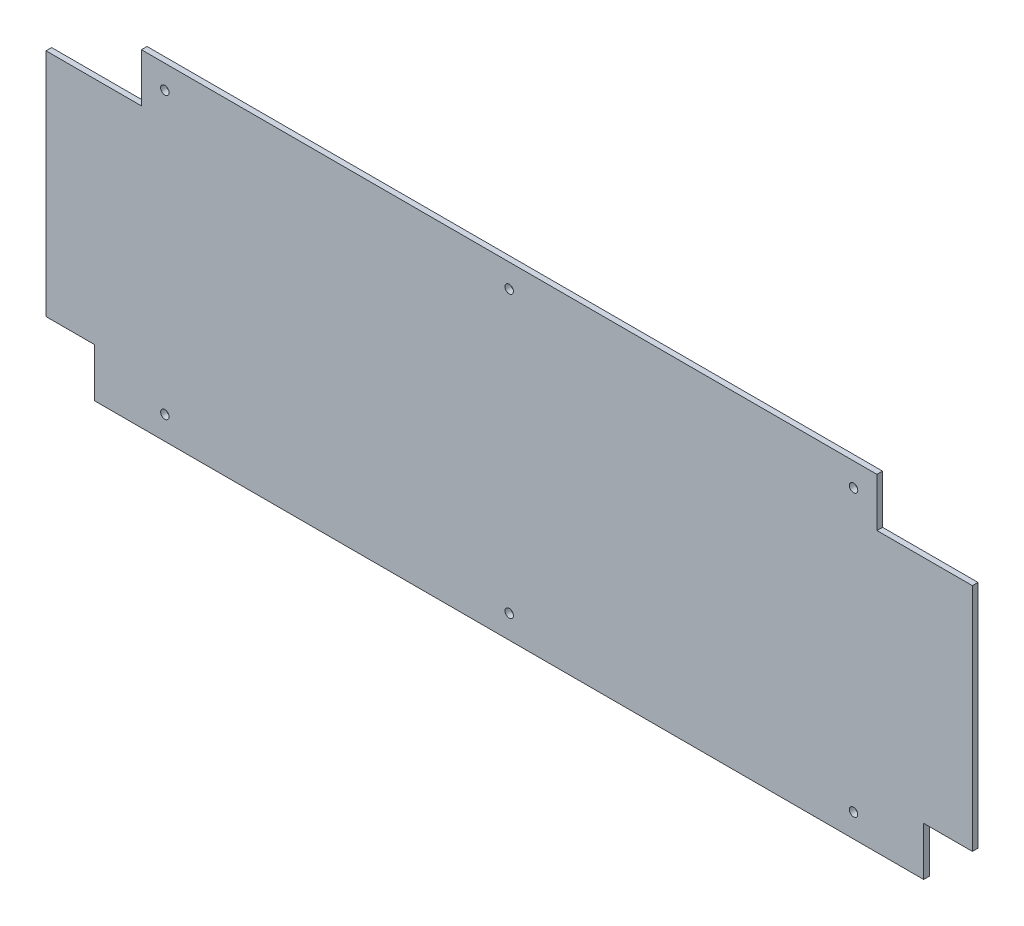
ISO-10303-21;
HEADER;
FILE_DESCRIPTION(('STEP AP214'),'2;1');
FILE_NAME('part.step','',(''),(''),'','','');
FILE_SCHEMA(('AUTOMOTIVE_DESIGN { 1 0 10303 214 1 1 1 1 }'));
ENDSEC;
DATA;
#1=APPLICATION_CONTEXT('core data for automotive mechanical design processes');
#2=APPLICATION_PROTOCOL_DEFINITION('international standard','automotive_design',2000,#1);
#3=PRODUCT_CONTEXT('',#1,'mechanical');
#4=PRODUCT('Part','Part','',(#3));
#5=PRODUCT_RELATED_PRODUCT_CATEGORY('part','',(#4));
#6=PRODUCT_DEFINITION_FORMATION('','',#4);
#7=PRODUCT_DEFINITION_CONTEXT('part definition',#1,'design');
#8=PRODUCT_DEFINITION('design','',#6,#7);
#9=PRODUCT_DEFINITION_SHAPE('','',#8);
#10=(LENGTH_UNIT() NAMED_UNIT(*) SI_UNIT(.MILLI.,.METRE.));
#11=(NAMED_UNIT(*) PLANE_ANGLE_UNIT() SI_UNIT($,.RADIAN.));
#12=(NAMED_UNIT(*) SI_UNIT($,.STERADIAN.) SOLID_ANGLE_UNIT());
#13=UNCERTAINTY_MEASURE_WITH_UNIT(LENGTH_MEASURE(1.E-05),#10,'distance_accuracy_value','');
#14=(GEOMETRIC_REPRESENTATION_CONTEXT(3) GLOBAL_UNCERTAINTY_ASSIGNED_CONTEXT((#13)) GLOBAL_UNIT_ASSIGNED_CONTEXT((#10,
#11,#12)) REPRESENTATION_CONTEXT('',''));
#15=CARTESIAN_POINT('',(0.,0.,0.));
#16=DIRECTION('',(0.,0.,1.));
#17=DIRECTION('',(1.,0.,0.));
#18=AXIS2_PLACEMENT_3D('',#15,#16,#17);
#19=CARTESIAN_POINT('',(0.,0.,0.));
#20=DIRECTION('',(0.,0.,-1.));
#21=DIRECTION('',(-1.,0.,0.));
#22=AXIS2_PLACEMENT_3D('',#19,#20,#21);
#23=PLANE('',#22);
#24=CARTESIAN_POINT('',(253.145266950842,12.5,0.));
#25=DIRECTION('',(0.,0.,1.));
#26=DIRECTION('',(1.,0.,0.));
#27=AXIS2_PLACEMENT_3D('',#24,#25,#26);
#28=CIRCLE('',#27,2.24999999999997);
#29=CARTESIAN_POINT('',(255.395266950842,12.5,0.));
#30=VERTEX_POINT('',#29);
#31=EDGE_CURVE('E290',#30,#30,#28,.T.);
#32=ORIENTED_EDGE('',*,*,#31,.T.);
#33=EDGE_LOOP('',(#32));
#34=FACE_BOUND('',#33,.T.);
#35=DIRECTION('',(0.,1.,0.));
#36=VECTOR('',#35,1.);
#37=CARTESIAN_POINT('',(449.64526695086,175.,0.));
#38=LINE('',#37,#36);
#39=CARTESIAN_POINT('',(449.64526695086,149.000000000001,0.));
#40=VERTEX_POINT('',#39);
#41=CARTESIAN_POINT('',(449.64526695086,175.,0.));
#42=VERTEX_POINT('',#41);
#43=EDGE_CURVE('E154',#40,#42,#38,.T.);
#44=ORIENTED_EDGE('',*,*,#43,.F.);
#45=DIRECTION('',(-1.,0.,0.));
#46=VECTOR('',#45,1.);
#47=CARTESIAN_POINT('',(500.64526695086,149.000000000001,0.));
#48=LINE('',#47,#46);
#49=CARTESIAN_POINT('',(500.64526695086,149.000000000001,0.));
#50=VERTEX_POINT('',#49);
#51=EDGE_CURVE('E97',#50,#40,#48,.T.);
#52=ORIENTED_EDGE('',*,*,#51,.F.);
#53=DIRECTION('',(0.,1.,0.));
#54=VECTOR('',#53,1.);
#55=CARTESIAN_POINT('',(500.64526695086,26.,0.));
#56=LINE('',#55,#54);
#57=CARTESIAN_POINT('',(500.64526695086,26.,0.));
#58=VERTEX_POINT('',#57);
#59=EDGE_CURVE('E91',#58,#50,#56,.T.);
#60=ORIENTED_EDGE('',*,*,#59,.F.);
#61=DIRECTION('',(1.,0.,0.));
#62=VECTOR('',#61,1.);
#63=CARTESIAN_POINT('',(500.64526695086,26.,0.));
#64=LINE('',#63,#62);
#65=CARTESIAN_POINT('',(474.64526695086,26.,0.));
#66=VERTEX_POINT('',#65);
#67=EDGE_CURVE('E144',#66,#58,#64,.T.);
#68=ORIENTED_EDGE('',*,*,#67,.F.);
#69=DIRECTION('',(0.,1.,0.));
#70=VECTOR('',#69,1.);
#71=CARTESIAN_POINT('',(474.64526695086,0.,0.));
#72=LINE('',#71,#70);
#73=CARTESIAN_POINT('',(474.64526695086,0.,0.));
#74=VERTEX_POINT('',#73);
#75=EDGE_CURVE('E172',#74,#66,#72,.T.);
#76=ORIENTED_EDGE('',*,*,#75,.F.);
#77=DIRECTION('',(1.,0.,0.));
#78=VECTOR('',#77,1.);
#79=CARTESIAN_POINT('',(31.6452669508233,0.,0.));
#80=LINE('',#79,#78);
#81=CARTESIAN_POINT('',(31.6452669508233,0.,0.));
#82=VERTEX_POINT('',#81);
#83=EDGE_CURVE('E170',#82,#74,#80,.T.);
#84=ORIENTED_EDGE('',*,*,#83,.F.);
#85=DIRECTION('',(0.,-1.,0.));
#86=VECTOR('',#85,1.);
#87=CARTESIAN_POINT('',(31.6452669508233,0.,0.));
#88=LINE('',#87,#86);
#89=CARTESIAN_POINT('',(31.6452669508233,26.,0.));
#90=VERTEX_POINT('',#89);
#91=EDGE_CURVE('E168',#90,#82,#88,.T.);
#92=ORIENTED_EDGE('',*,*,#91,.F.);
#93=DIRECTION('',(1.,0.,0.));
#94=VECTOR('',#93,1.);
#95=CARTESIAN_POINT('',(5.64526695082328,26.,0.));
#96=LINE('',#95,#94);
#97=CARTESIAN_POINT('',(5.64526695082328,26.,0.));
#98=VERTEX_POINT('',#97);
#99=EDGE_CURVE('E166',#98,#90,#96,.T.);
#100=ORIENTED_EDGE('',*,*,#99,.F.);
#101=DIRECTION('',(0.,-1.,0.));
#102=VECTOR('',#101,1.);
#103=CARTESIAN_POINT('',(5.64526695082328,26.,0.));
#104=LINE('',#103,#102);
#105=CARTESIAN_POINT('',(5.64526695082328,149.,0.));
#106=VERTEX_POINT('',#105);
#107=EDGE_CURVE('E164',#106,#98,#104,.T.);
#108=ORIENTED_EDGE('',*,*,#107,.F.);
#109=DIRECTION('',(-1.,0.,0.));
#110=VECTOR('',#109,1.);
#111=CARTESIAN_POINT('',(5.64526695082328,149.,0.));
#112=LINE('',#111,#110);
#113=CARTESIAN_POINT('',(56.6452669508233,149.,0.));
#114=VERTEX_POINT('',#113);
#115=EDGE_CURVE('E162',#114,#106,#112,.T.);
#116=ORIENTED_EDGE('',*,*,#115,.F.);
#117=DIRECTION('',(0.,-1.,0.));
#118=VECTOR('',#117,1.);
#119=CARTESIAN_POINT('',(56.6452669508233,175.,0.));
#120=LINE('',#119,#118);
#121=CARTESIAN_POINT('',(56.6452669508233,175.,0.));
#122=VERTEX_POINT('',#121);
#123=EDGE_CURVE('E160',#122,#114,#120,.T.);
#124=ORIENTED_EDGE('',*,*,#123,.F.);
#125=DIRECTION('',(-1.,0.,0.));
#126=VECTOR('',#125,1.);
#127=CARTESIAN_POINT('',(56.6452669508233,175.,0.));
#128=LINE('',#127,#126);
#129=EDGE_CURVE('E157',#42,#122,#128,.T.);
#130=ORIENTED_EDGE('',*,*,#129,.F.);
#131=EDGE_LOOP('',(#44,#52,#60,#68,#76,#84,#92,#100,#108,#116,#124,#130));
#132=FACE_BOUND('',#131,.T.);
#133=CARTESIAN_POINT('',(69.1452669508233,12.5,0.));
#134=DIRECTION('',(0.,0.,1.));
#135=DIRECTION('',(1.,0.,0.));
#136=AXIS2_PLACEMENT_3D('',#133,#134,#135);
#137=CIRCLE('',#136,2.25);
#138=CARTESIAN_POINT('',(71.3952669508233,12.5,0.));
#139=VERTEX_POINT('',#138);
#140=EDGE_CURVE('E158',#139,#139,#137,.T.);
#141=ORIENTED_EDGE('',*,*,#140,.T.);
#142=EDGE_LOOP('',(#141));
#143=FACE_BOUND('',#142,.T.);
#144=CARTESIAN_POINT('',(69.1452669508233,162.5,0.));
#145=DIRECTION('',(0.,0.,1.));
#146=DIRECTION('',(1.,0.,0.));
#147=AXIS2_PLACEMENT_3D('',#144,#145,#146);
#148=CIRCLE('',#147,2.25);
#149=CARTESIAN_POINT('',(71.3952669508233,162.5,0.));
#150=VERTEX_POINT('',#149);
#151=EDGE_CURVE('E318',#150,#150,#148,.T.);
#152=ORIENTED_EDGE('',*,*,#151,.T.);
#153=EDGE_LOOP('',(#152));
#154=FACE_BOUND('',#153,.T.);
#155=CARTESIAN_POINT('',(437.14526695086,162.5,0.));
#156=DIRECTION('',(0.,0.,1.));
#157=DIRECTION('',(1.,0.,0.));
#158=AXIS2_PLACEMENT_3D('',#155,#156,#157);
#159=CIRCLE('',#158,2.24999999999997);
#160=CARTESIAN_POINT('',(439.39526695086,162.5,0.));
#161=VERTEX_POINT('',#160);
#162=EDGE_CURVE('E312',#161,#161,#159,.T.);
#163=ORIENTED_EDGE('',*,*,#162,.T.);
#164=EDGE_LOOP('',(#163));
#165=FACE_BOUND('',#164,.T.);
#166=CARTESIAN_POINT('',(437.14526695086,12.5,0.));
#167=DIRECTION('',(0.,0.,1.));
#168=DIRECTION('',(1.,0.,0.));
#169=AXIS2_PLACEMENT_3D('',#166,#167,#168);
#170=CIRCLE('',#169,2.24999999999997);
#171=CARTESIAN_POINT('',(439.39526695086,12.5,0.));
#172=VERTEX_POINT('',#171);
#173=EDGE_CURVE('E306',#172,#172,#170,.T.);
#174=ORIENTED_EDGE('',*,*,#173,.T.);
#175=EDGE_LOOP('',(#174));
#176=FACE_BOUND('',#175,.T.);
#177=CARTESIAN_POINT('',(253.145266950842,162.5,0.));
#178=DIRECTION('',(0.,0.,1.));
#179=DIRECTION('',(1.,0.,0.));
#180=AXIS2_PLACEMENT_3D('',#177,#178,#179);
#181=CIRCLE('',#180,2.24999999999997);
#182=CARTESIAN_POINT('',(255.395266950842,162.5,0.));
#183=VERTEX_POINT('',#182);
#184=EDGE_CURVE('E300',#183,#183,#181,.T.);
#185=ORIENTED_EDGE('',*,*,#184,.T.);
#186=EDGE_LOOP('',(#185));
#187=FACE_BOUND('',#186,.T.);
#188=ADVANCED_FACE('F33',(#34,#132,#143,#154,#165,#176,#187),#23,.T.);
#189=CARTESIAN_POINT('',(449.64526695086,175.,3.));
#190=DIRECTION('',(-1.,0.,0.));
#191=DIRECTION('',(0.,0.,1.));
#192=AXIS2_PLACEMENT_3D('',#189,#190,#191);
#193=PLANE('',#192);
#194=ORIENTED_EDGE('',*,*,#43,.T.);
#195=DIRECTION('',(0.,0.,-1.));
#196=VECTOR('',#195,1.);
#197=CARTESIAN_POINT('',(449.64526695086,175.,3.));
#198=LINE('',#197,#196);
#199=CARTESIAN_POINT('',(449.64526695086,175.,3.));
#200=VERTEX_POINT('',#199);
#201=EDGE_CURVE('E11',#200,#42,#198,.T.);
#202=ORIENTED_EDGE('',*,*,#201,.F.);
#203=DIRECTION('',(0.,1.,0.));
#204=VECTOR('',#203,1.);
#205=CARTESIAN_POINT('',(449.64526695086,175.,3.));
#206=LINE('',#205,#204);
#207=CARTESIAN_POINT('',(449.64526695086,149.000000000001,3.));
#208=VERTEX_POINT('',#207);
#209=EDGE_CURVE('E177',#208,#200,#206,.T.);
#210=ORIENTED_EDGE('',*,*,#209,.F.);
#211=DIRECTION('',(0.,0.,-1.));
#212=VECTOR('',#211,1.);
#213=CARTESIAN_POINT('',(449.64526695086,149.000000000001,3.));
#214=LINE('',#213,#212);
#215=EDGE_CURVE('E150',#208,#40,#214,.T.);
#216=ORIENTED_EDGE('',*,*,#215,.T.);
#217=EDGE_LOOP('',(#194,#202,#210,#216));
#218=FACE_BOUND('',#217,.T.);
#219=ADVANCED_FACE('F35',(#218),#193,.F.);
#220=CARTESIAN_POINT('',(56.6452669508233,175.,3.));
#221=DIRECTION('',(0.,-1.,0.));
#222=DIRECTION('',(0.,0.,-1.));
#223=AXIS2_PLACEMENT_3D('',#220,#221,#222);
#224=PLANE('',#223);
#225=ORIENTED_EDGE('',*,*,#129,.T.);
#226=DIRECTION('',(0.,0.,-1.));
#227=VECTOR('',#226,1.);
#228=CARTESIAN_POINT('',(56.6452669508233,175.,3.));
#229=LINE('',#228,#227);
#230=CARTESIAN_POINT('',(56.6452669508233,175.,3.));
#231=VERTEX_POINT('',#230);
#232=EDGE_CURVE('E42',#231,#122,#229,.T.);
#233=ORIENTED_EDGE('',*,*,#232,.F.);
#234=DIRECTION('',(-1.,0.,0.));
#235=VECTOR('',#234,1.);
#236=CARTESIAN_POINT('',(56.6452669508233,175.,3.));
#237=LINE('',#236,#235);
#238=EDGE_CURVE('E105',#200,#231,#237,.T.);
#239=ORIENTED_EDGE('',*,*,#238,.F.);
#240=ORIENTED_EDGE('',*,*,#201,.T.);
#241=EDGE_LOOP('',(#225,#233,#239,#240));
#242=FACE_BOUND('',#241,.T.);
#243=ADVANCED_FACE('F261',(#242),#224,.F.);
#244=CARTESIAN_POINT('',(56.6452669508233,175.,3.));
#245=DIRECTION('',(1.,0.,0.));
#246=DIRECTION('',(0.,0.,-1.));
#247=AXIS2_PLACEMENT_3D('',#244,#245,#246);
#248=PLANE('',#247);
#249=ORIENTED_EDGE('',*,*,#123,.T.);
#250=DIRECTION('',(0.,0.,-1.));
#251=VECTOR('',#250,1.);
#252=CARTESIAN_POINT('',(56.6452669508233,149.,3.));
#253=LINE('',#252,#251);
#254=CARTESIAN_POINT('',(56.6452669508233,149.,3.));
#255=VERTEX_POINT('',#254);
#256=EDGE_CURVE('E196',#255,#114,#253,.T.);
#257=ORIENTED_EDGE('',*,*,#256,.F.);
#258=DIRECTION('',(0.,-1.,0.));
#259=VECTOR('',#258,1.);
#260=CARTESIAN_POINT('',(56.6452669508233,175.,3.));
#261=LINE('',#260,#259);
#262=EDGE_CURVE('E204',#231,#255,#261,.T.);
#263=ORIENTED_EDGE('',*,*,#262,.F.);
#264=ORIENTED_EDGE('',*,*,#232,.T.);
#265=EDGE_LOOP('',(#249,#257,#263,#264));
#266=FACE_BOUND('',#265,.T.);
#267=ADVANCED_FACE('F202',(#266),#248,.F.);
#268=CARTESIAN_POINT('',(5.64526695082328,149.,3.));
#269=DIRECTION('',(0.,-1.,0.));
#270=DIRECTION('',(0.,0.,-1.));
#271=AXIS2_PLACEMENT_3D('',#268,#269,#270);
#272=PLANE('',#271);
#273=ORIENTED_EDGE('',*,*,#115,.T.);
#274=DIRECTION('',(0.,0.,-1.));
#275=VECTOR('',#274,1.);
#276=CARTESIAN_POINT('',(5.64526695082328,149.,3.));
#277=LINE('',#276,#275);
#278=CARTESIAN_POINT('',(5.64526695082328,149.,3.));
#279=VERTEX_POINT('',#278);
#280=EDGE_CURVE('E193',#279,#106,#277,.T.);
#281=ORIENTED_EDGE('',*,*,#280,.F.);
#282=DIRECTION('',(-1.,0.,0.));
#283=VECTOR('',#282,1.);
#284=CARTESIAN_POINT('',(5.64526695082328,149.,3.));
#285=LINE('',#284,#283);
#286=EDGE_CURVE('E222',#255,#279,#285,.T.);
#287=ORIENTED_EDGE('',*,*,#286,.F.);
#288=ORIENTED_EDGE('',*,*,#256,.T.);
#289=EDGE_LOOP('',(#273,#281,#287,#288));
#290=FACE_BOUND('',#289,.T.);
#291=ADVANCED_FACE('F213',(#290),#272,.F.);
#292=CARTESIAN_POINT('',(5.64526695082328,26.,3.));
#293=DIRECTION('',(1.,0.,0.));
#294=DIRECTION('',(0.,0.,-1.));
#295=AXIS2_PLACEMENT_3D('',#292,#293,#294);
#296=PLANE('',#295);
#297=ORIENTED_EDGE('',*,*,#107,.T.);
#298=DIRECTION('',(0.,0.,-1.));
#299=VECTOR('',#298,1.);
#300=CARTESIAN_POINT('',(5.64526695082328,26.,3.));
#301=LINE('',#300,#299);
#302=CARTESIAN_POINT('',(5.64526695082328,26.,3.));
#303=VERTEX_POINT('',#302);
#304=EDGE_CURVE('E190',#303,#98,#301,.T.);
#305=ORIENTED_EDGE('',*,*,#304,.F.);
#306=DIRECTION('',(0.,-1.,0.));
#307=VECTOR('',#306,1.);
#308=CARTESIAN_POINT('',(5.64526695082328,26.,3.));
#309=LINE('',#308,#307);
#310=EDGE_CURVE('E219',#279,#303,#309,.T.);
#311=ORIENTED_EDGE('',*,*,#310,.F.);
#312=ORIENTED_EDGE('',*,*,#280,.T.);
#313=EDGE_LOOP('',(#297,#305,#311,#312));
#314=FACE_BOUND('',#313,.T.);
#315=ADVANCED_FACE('F217',(#314),#296,.F.);
#316=CARTESIAN_POINT('',(5.64526695082328,26.,3.));
#317=DIRECTION('',(0.,1.,0.));
#318=DIRECTION('',(0.,0.,1.));
#319=AXIS2_PLACEMENT_3D('',#316,#317,#318);
#320=PLANE('',#319);
#321=ORIENTED_EDGE('',*,*,#99,.T.);
#322=DIRECTION('',(0.,0.,-1.));
#323=VECTOR('',#322,1.);
#324=CARTESIAN_POINT('',(31.6452669508233,26.,3.));
#325=LINE('',#324,#323);
#326=CARTESIAN_POINT('',(31.6452669508233,26.,3.));
#327=VERTEX_POINT('',#326);
#328=EDGE_CURVE('E187',#327,#90,#325,.T.);
#329=ORIENTED_EDGE('',*,*,#328,.F.);
#330=DIRECTION('',(1.,0.,0.));
#331=VECTOR('',#330,1.);
#332=CARTESIAN_POINT('',(5.64526695082328,26.,3.));
#333=LINE('',#332,#331);
#334=EDGE_CURVE('E221',#303,#327,#333,.T.);
#335=ORIENTED_EDGE('',*,*,#334,.F.);
#336=ORIENTED_EDGE('',*,*,#304,.T.);
#337=EDGE_LOOP('',(#321,#329,#335,#336));
#338=FACE_BOUND('',#337,.T.);
#339=ADVANCED_FACE('F423',(#338),#320,.F.);
#340=CARTESIAN_POINT('',(31.6452669508233,0.,3.));
#341=DIRECTION('',(1.,0.,0.));
#342=DIRECTION('',(0.,0.,-1.));
#343=AXIS2_PLACEMENT_3D('',#340,#341,#342);
#344=PLANE('',#343);
#345=ORIENTED_EDGE('',*,*,#91,.T.);
#346=DIRECTION('',(0.,0.,-1.));
#347=VECTOR('',#346,1.);
#348=CARTESIAN_POINT('',(31.6452669508233,0.,3.));
#349=LINE('',#348,#347);
#350=CARTESIAN_POINT('',(31.6452669508233,0.,3.));
#351=VERTEX_POINT('',#350);
#352=EDGE_CURVE('E184',#351,#82,#349,.T.);
#353=ORIENTED_EDGE('',*,*,#352,.F.);
#354=DIRECTION('',(0.,-1.,0.));
#355=VECTOR('',#354,1.);
#356=CARTESIAN_POINT('',(31.6452669508233,0.,3.));
#357=LINE('',#356,#355);
#358=EDGE_CURVE('E224',#327,#351,#357,.T.);
#359=ORIENTED_EDGE('',*,*,#358,.F.);
#360=ORIENTED_EDGE('',*,*,#328,.T.);
#361=EDGE_LOOP('',(#345,#353,#359,#360));
#362=FACE_BOUND('',#361,.T.);
#363=ADVANCED_FACE('F414',(#362),#344,.F.);
#364=CARTESIAN_POINT('',(31.6452669508233,0.,3.));
#365=DIRECTION('',(0.,1.,0.));
#366=DIRECTION('',(-1.,0.,0.));
#367=AXIS2_PLACEMENT_3D('',#364,#365,#366);
#368=PLANE('',#367);
#369=ORIENTED_EDGE('',*,*,#83,.T.);
#370=DIRECTION('',(0.,0.,-1.));
#371=VECTOR('',#370,1.);
#372=CARTESIAN_POINT('',(474.64526695086,0.,3.));
#373=LINE('',#372,#371);
#374=CARTESIAN_POINT('',(474.64526695086,0.,3.));
#375=VERTEX_POINT('',#374);
#376=EDGE_CURVE('E181',#375,#74,#373,.T.);
#377=ORIENTED_EDGE('',*,*,#376,.F.);
#378=DIRECTION('',(1.,0.,0.));
#379=VECTOR('',#378,1.);
#380=CARTESIAN_POINT('',(31.6452669508233,0.,3.));
#381=LINE('',#380,#379);
#382=EDGE_CURVE('E230',#351,#375,#381,.T.);
#383=ORIENTED_EDGE('',*,*,#382,.F.);
#384=ORIENTED_EDGE('',*,*,#352,.T.);
#385=EDGE_LOOP('',(#369,#377,#383,#384));
#386=FACE_BOUND('',#385,.T.);
#387=ADVANCED_FACE('F236',(#386),#368,.F.);
#388=CARTESIAN_POINT('',(474.64526695086,0.,3.));
#389=DIRECTION('',(-1.,0.,0.));
#390=DIRECTION('',(0.,0.,1.));
#391=AXIS2_PLACEMENT_3D('',#388,#389,#390);
#392=PLANE('',#391);
#393=ORIENTED_EDGE('',*,*,#75,.T.);
#394=DIRECTION('',(0.,0.,-1.));
#395=VECTOR('',#394,1.);
#396=CARTESIAN_POINT('',(474.64526695086,26.,3.));
#397=LINE('',#396,#395);
#398=CARTESIAN_POINT('',(474.64526695086,26.,3.));
#399=VERTEX_POINT('',#398);
#400=EDGE_CURVE('E145',#399,#66,#397,.T.);
#401=ORIENTED_EDGE('',*,*,#400,.F.);
#402=DIRECTION('',(0.,1.,0.));
#403=VECTOR('',#402,1.);
#404=CARTESIAN_POINT('',(474.64526695086,0.,3.));
#405=LINE('',#404,#403);
#406=EDGE_CURVE('E136',#375,#399,#405,.T.);
#407=ORIENTED_EDGE('',*,*,#406,.F.);
#408=ORIENTED_EDGE('',*,*,#376,.T.);
#409=EDGE_LOOP('',(#393,#401,#407,#408));
#410=FACE_BOUND('',#409,.T.);
#411=ADVANCED_FACE('F240',(#410),#392,.F.);
#412=CARTESIAN_POINT('',(500.64526695086,26.,3.));
#413=DIRECTION('',(0.,1.,0.));
#414=DIRECTION('',(-1.,0.,0.));
#415=AXIS2_PLACEMENT_3D('',#412,#413,#414);
#416=PLANE('',#415);
#417=ORIENTED_EDGE('',*,*,#67,.T.);
#418=DIRECTION('',(0.,0.,-1.));
#419=VECTOR('',#418,1.);
#420=CARTESIAN_POINT('',(500.64526695086,26.,3.));
#421=LINE('',#420,#419);
#422=CARTESIAN_POINT('',(500.64526695086,26.,3.));
#423=VERTEX_POINT('',#422);
#424=EDGE_CURVE('E141',#423,#58,#421,.T.);
#425=ORIENTED_EDGE('',*,*,#424,.F.);
#426=DIRECTION('',(1.,0.,0.));
#427=VECTOR('',#426,1.);
#428=CARTESIAN_POINT('',(500.64526695086,26.,3.));
#429=LINE('',#428,#427);
#430=EDGE_CURVE('E130',#399,#423,#429,.T.);
#431=ORIENTED_EDGE('',*,*,#430,.F.);
#432=ORIENTED_EDGE('',*,*,#400,.T.);
#433=EDGE_LOOP('',(#417,#425,#431,#432));
#434=FACE_BOUND('',#433,.T.);
#435=ADVANCED_FACE('F142',(#434),#416,.F.);
#436=CARTESIAN_POINT('',(500.64526695086,26.,3.));
#437=DIRECTION('',(-1.,0.,0.));
#438=DIRECTION('',(0.,0.,1.));
#439=AXIS2_PLACEMENT_3D('',#436,#437,#438);
#440=PLANE('',#439);
#441=ORIENTED_EDGE('',*,*,#59,.T.);
#442=DIRECTION('',(0.,0.,-1.));
#443=VECTOR('',#442,1.);
#444=CARTESIAN_POINT('',(500.64526695086,149.000000000001,3.));
#445=LINE('',#444,#443);
#446=CARTESIAN_POINT('',(500.64526695086,149.000000000001,3.));
#447=VERTEX_POINT('',#446);
#448=EDGE_CURVE('E146',#447,#50,#445,.T.);
#449=ORIENTED_EDGE('',*,*,#448,.F.);
#450=DIRECTION('',(0.,1.,0.));
#451=VECTOR('',#450,1.);
#452=CARTESIAN_POINT('',(500.64526695086,26.,3.));
#453=LINE('',#452,#451);
#454=EDGE_CURVE('E134',#423,#447,#453,.T.);
#455=ORIENTED_EDGE('',*,*,#454,.F.);
#456=ORIENTED_EDGE('',*,*,#424,.T.);
#457=EDGE_LOOP('',(#441,#449,#455,#456));
#458=FACE_BOUND('',#457,.T.);
#459=ADVANCED_FACE('F148',(#458),#440,.F.);
#460=CARTESIAN_POINT('',(500.64526695086,149.000000000001,3.));
#461=DIRECTION('',(0.,-1.,0.));
#462=DIRECTION('',(1.,0.,0.));
#463=AXIS2_PLACEMENT_3D('',#460,#461,#462);
#464=PLANE('',#463);
#465=ORIENTED_EDGE('',*,*,#51,.T.);
#466=ORIENTED_EDGE('',*,*,#215,.F.);
#467=DIRECTION('',(-1.,0.,0.));
#468=VECTOR('',#467,1.);
#469=CARTESIAN_POINT('',(500.64526695086,149.000000000001,3.));
#470=LINE('',#469,#468);
#471=EDGE_CURVE('E50',#447,#208,#470,.T.);
#472=ORIENTED_EDGE('',*,*,#471,.F.);
#473=ORIENTED_EDGE('',*,*,#448,.T.);
#474=EDGE_LOOP('',(#465,#466,#472,#473));
#475=FACE_BOUND('',#474,.T.);
#476=ADVANCED_FACE('F244',(#475),#464,.F.);
#477=CARTESIAN_POINT('',(0.,0.,3.));
#478=DIRECTION('',(0.,0.,-1.));
#479=DIRECTION('',(-1.,0.,0.));
#480=AXIS2_PLACEMENT_3D('',#477,#478,#479);
#481=PLANE('',#480);
#482=CARTESIAN_POINT('',(253.145266950842,12.5,3.));
#483=DIRECTION('',(0.,0.,1.));
#484=DIRECTION('',(1.,0.,0.));
#485=AXIS2_PLACEMENT_3D('',#482,#483,#484);
#486=CIRCLE('',#485,2.24999999999997);
#487=CARTESIAN_POINT('',(255.395266950842,12.5,3.));
#488=VERTEX_POINT('',#487);
#489=EDGE_CURVE('E293',#488,#488,#486,.T.);
#490=ORIENTED_EDGE('',*,*,#489,.F.);
#491=EDGE_LOOP('',(#490));
#492=FACE_BOUND('',#491,.T.);
#493=CARTESIAN_POINT('',(253.145266950842,162.5,3.));
#494=DIRECTION('',(0.,0.,1.));
#495=DIRECTION('',(1.,0.,0.));
#496=AXIS2_PLACEMENT_3D('',#493,#494,#495);
#497=CIRCLE('',#496,2.24999999999997);
#498=CARTESIAN_POINT('',(255.395266950842,162.5,3.));
#499=VERTEX_POINT('',#498);
#500=EDGE_CURVE('E295',#499,#499,#497,.T.);
#501=ORIENTED_EDGE('',*,*,#500,.F.);
#502=EDGE_LOOP('',(#501));
#503=FACE_BOUND('',#502,.T.);
#504=CARTESIAN_POINT('',(437.14526695086,12.5,3.));
#505=DIRECTION('',(0.,0.,1.));
#506=DIRECTION('',(1.,0.,0.));
#507=AXIS2_PLACEMENT_3D('',#504,#505,#506);
#508=CIRCLE('',#507,2.24999999999997);
#509=CARTESIAN_POINT('',(439.39526695086,12.5,3.));
#510=VERTEX_POINT('',#509);
#511=EDGE_CURVE('E303',#510,#510,#508,.T.);
#512=ORIENTED_EDGE('',*,*,#511,.F.);
#513=EDGE_LOOP('',(#512));
#514=FACE_BOUND('',#513,.T.);
#515=CARTESIAN_POINT('',(437.14526695086,162.5,3.));
#516=DIRECTION('',(0.,0.,1.));
#517=DIRECTION('',(1.,0.,0.));
#518=AXIS2_PLACEMENT_3D('',#515,#516,#517);
#519=CIRCLE('',#518,2.24999999999997);
#520=CARTESIAN_POINT('',(439.39526695086,162.5,3.));
#521=VERTEX_POINT('',#520);
#522=EDGE_CURVE('E309',#521,#521,#519,.T.);
#523=ORIENTED_EDGE('',*,*,#522,.F.);
#524=EDGE_LOOP('',(#523));
#525=FACE_BOUND('',#524,.T.);
#526=CARTESIAN_POINT('',(69.1452669508233,162.5,3.));
#527=DIRECTION('',(0.,0.,1.));
#528=DIRECTION('',(1.,0.,0.));
#529=AXIS2_PLACEMENT_3D('',#526,#527,#528);
#530=CIRCLE('',#529,2.25);
#531=CARTESIAN_POINT('',(71.3952669508233,162.5,3.));
#532=VERTEX_POINT('',#531);
#533=EDGE_CURVE('E315',#532,#532,#530,.T.);
#534=ORIENTED_EDGE('',*,*,#533,.F.);
#535=EDGE_LOOP('',(#534));
#536=FACE_BOUND('',#535,.T.);
#537=CARTESIAN_POINT('',(69.1452669508233,12.5,3.));
#538=DIRECTION('',(0.,0.,1.));
#539=DIRECTION('',(1.,0.,0.));
#540=AXIS2_PLACEMENT_3D('',#537,#538,#539);
#541=CIRCLE('',#540,2.25);
#542=CARTESIAN_POINT('',(71.3952669508233,12.5,3.));
#543=VERTEX_POINT('',#542);
#544=EDGE_CURVE('E321',#543,#543,#541,.T.);
#545=ORIENTED_EDGE('',*,*,#544,.F.);
#546=EDGE_LOOP('',(#545));
#547=FACE_BOUND('',#546,.T.);
#548=ORIENTED_EDGE('',*,*,#209,.T.);
#549=ORIENTED_EDGE('',*,*,#238,.T.);
#550=ORIENTED_EDGE('',*,*,#262,.T.);
#551=ORIENTED_EDGE('',*,*,#286,.T.);
#552=ORIENTED_EDGE('',*,*,#310,.T.);
#553=ORIENTED_EDGE('',*,*,#334,.T.);
#554=ORIENTED_EDGE('',*,*,#358,.T.);
#555=ORIENTED_EDGE('',*,*,#382,.T.);
#556=ORIENTED_EDGE('',*,*,#406,.T.);
#557=ORIENTED_EDGE('',*,*,#430,.T.);
#558=ORIENTED_EDGE('',*,*,#454,.T.);
#559=ORIENTED_EDGE('',*,*,#471,.T.);
#560=EDGE_LOOP('',(#548,#549,#550,#551,#552,#553,#554,#555,#556,#557,#558,#559));
#561=FACE_BOUND('',#560,.T.);
#562=ADVANCED_FACE('F132',(#492,#503,#514,#525,#536,#547,#561),#481,.F.);
#563=CARTESIAN_POINT('',(69.1452669508233,12.5,3.));
#564=DIRECTION('',(0.,0.,1.));
#565=DIRECTION('',(1.,0.,0.));
#566=AXIS2_PLACEMENT_3D('',#563,#564,#565);
#567=CYLINDRICAL_SURFACE('',#566,2.25);
#568=ORIENTED_EDGE('',*,*,#140,.F.);
#569=EDGE_LOOP('',(#568));
#570=FACE_BOUND('',#569,.T.);
#571=ORIENTED_EDGE('',*,*,#544,.T.);
#572=EDGE_LOOP('',(#571));
#573=FACE_BOUND('',#572,.T.);
#574=ADVANCED_FACE('F251',(#570,#573),#567,.F.);
#575=CARTESIAN_POINT('',(69.1452669508233,162.5,3.));
#576=DIRECTION('',(0.,0.,1.));
#577=DIRECTION('',(1.,0.,0.));
#578=AXIS2_PLACEMENT_3D('',#575,#576,#577);
#579=CYLINDRICAL_SURFACE('',#578,2.25);
#580=ORIENTED_EDGE('',*,*,#151,.F.);
#581=EDGE_LOOP('',(#580));
#582=FACE_BOUND('',#581,.T.);
#583=ORIENTED_EDGE('',*,*,#533,.T.);
#584=EDGE_LOOP('',(#583));
#585=FACE_BOUND('',#584,.T.);
#586=ADVANCED_FACE('F266',(#582,#585),#579,.F.);
#587=CARTESIAN_POINT('',(437.14526695086,162.5,3.));
#588=DIRECTION('',(0.,0.,1.));
#589=DIRECTION('',(1.,0.,0.));
#590=AXIS2_PLACEMENT_3D('',#587,#588,#589);
#591=CYLINDRICAL_SURFACE('',#590,2.24999999999997);
#592=ORIENTED_EDGE('',*,*,#162,.F.);
#593=EDGE_LOOP('',(#592));
#594=FACE_BOUND('',#593,.T.);
#595=ORIENTED_EDGE('',*,*,#522,.T.);
#596=EDGE_LOOP('',(#595));
#597=FACE_BOUND('',#596,.T.);
#598=ADVANCED_FACE('F270',(#594,#597),#591,.F.);
#599=CARTESIAN_POINT('',(437.14526695086,12.5,3.));
#600=DIRECTION('',(0.,0.,1.));
#601=DIRECTION('',(1.,0.,0.));
#602=AXIS2_PLACEMENT_3D('',#599,#600,#601);
#603=CYLINDRICAL_SURFACE('',#602,2.24999999999997);
#604=ORIENTED_EDGE('',*,*,#173,.F.);
#605=EDGE_LOOP('',(#604));
#606=FACE_BOUND('',#605,.T.);
#607=ORIENTED_EDGE('',*,*,#511,.T.);
#608=EDGE_LOOP('',(#607));
#609=FACE_BOUND('',#608,.T.);
#610=ADVANCED_FACE('F274',(#606,#609),#603,.F.);
#611=CARTESIAN_POINT('',(253.145266950842,162.5,3.));
#612=DIRECTION('',(0.,0.,1.));
#613=DIRECTION('',(1.,0.,0.));
#614=AXIS2_PLACEMENT_3D('',#611,#612,#613);
#615=CYLINDRICAL_SURFACE('',#614,2.24999999999997);
#616=ORIENTED_EDGE('',*,*,#184,.F.);
#617=EDGE_LOOP('',(#616));
#618=FACE_BOUND('',#617,.T.);
#619=ORIENTED_EDGE('',*,*,#500,.T.);
#620=EDGE_LOOP('',(#619));
#621=FACE_BOUND('',#620,.T.);
#622=ADVANCED_FACE('F278',(#618,#621),#615,.F.);
#623=CARTESIAN_POINT('',(253.145266950842,12.5,3.));
#624=DIRECTION('',(0.,0.,1.));
#625=DIRECTION('',(1.,0.,0.));
#626=AXIS2_PLACEMENT_3D('',#623,#624,#625);
#627=CYLINDRICAL_SURFACE('',#626,2.24999999999997);
#628=ORIENTED_EDGE('',*,*,#31,.F.);
#629=EDGE_LOOP('',(#628));
#630=FACE_BOUND('',#629,.T.);
#631=ORIENTED_EDGE('',*,*,#489,.T.);
#632=EDGE_LOOP('',(#631));
#633=FACE_BOUND('',#632,.T.);
#634=ADVANCED_FACE('F282',(#630,#633),#627,.F.);
#635=CLOSED_SHELL('',(#188,#219,#243,#267,#291,#315,#339,#363,#387,#411,#435,#459,#476,#562,
#574,#586,#598,#610,#622,#634));
#636=MANIFOLD_SOLID_BREP('B2',#635);
#637=ADVANCED_BREP_SHAPE_REPRESENTATION('',(#18,#636),#14);
#638=SHAPE_DEFINITION_REPRESENTATION(#9,#637);
ENDSEC;
END-ISO-10303-21;
